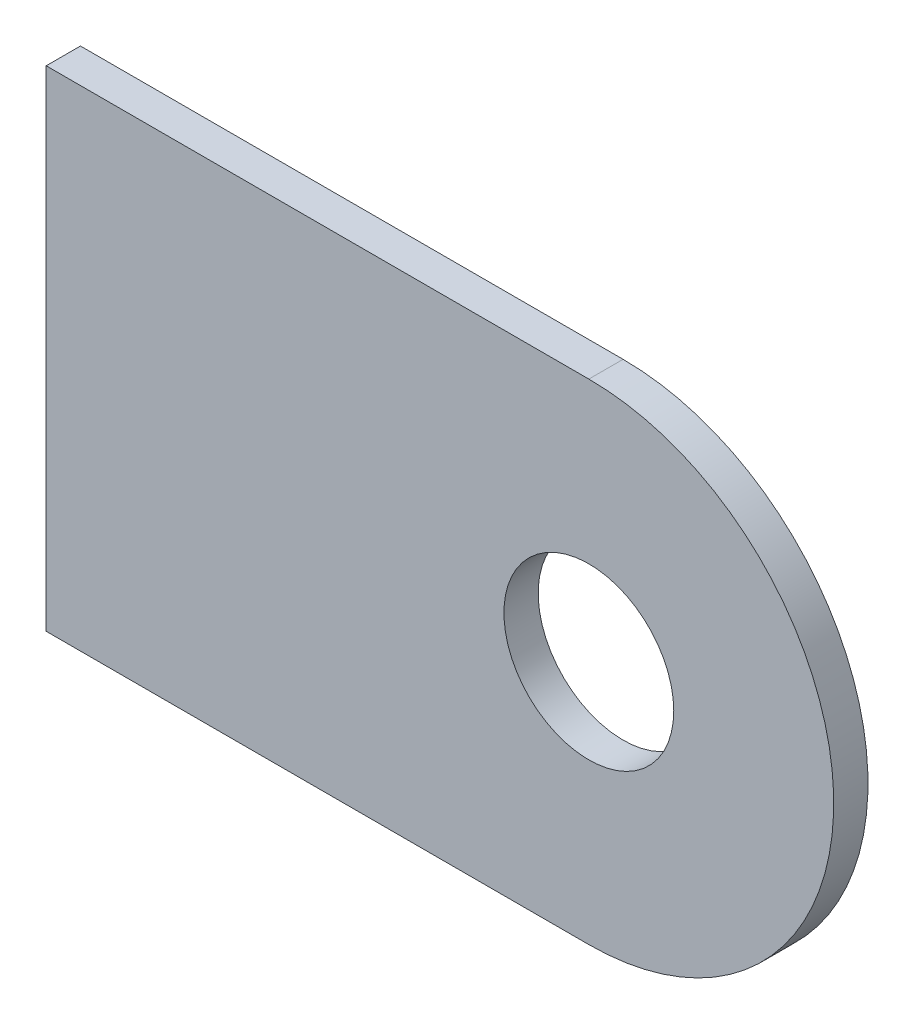
ISO-10303-21;
HEADER;
FILE_DESCRIPTION(('STEP AP214'),'2;1');
FILE_NAME('part.step','',(''),(''),'','','');
FILE_SCHEMA(('AUTOMOTIVE_DESIGN { 1 0 10303 214 1 1 1 1 }'));
ENDSEC;
DATA;
#1=APPLICATION_CONTEXT('core data for automotive mechanical design processes');
#2=APPLICATION_PROTOCOL_DEFINITION('international standard','automotive_design',2000,#1);
#3=PRODUCT_CONTEXT('',#1,'mechanical');
#4=PRODUCT('Part','Part','',(#3));
#5=PRODUCT_RELATED_PRODUCT_CATEGORY('part','',(#4));
#6=PRODUCT_DEFINITION_FORMATION('','',#4);
#7=PRODUCT_DEFINITION_CONTEXT('part definition',#1,'design');
#8=PRODUCT_DEFINITION('design','',#6,#7);
#9=PRODUCT_DEFINITION_SHAPE('','',#8);
#10=(LENGTH_UNIT() NAMED_UNIT(*) SI_UNIT(.MILLI.,.METRE.));
#11=(NAMED_UNIT(*) PLANE_ANGLE_UNIT() SI_UNIT($,.RADIAN.));
#12=(NAMED_UNIT(*) SI_UNIT($,.STERADIAN.) SOLID_ANGLE_UNIT());
#13=UNCERTAINTY_MEASURE_WITH_UNIT(LENGTH_MEASURE(1.E-05),#10,'distance_accuracy_value','');
#14=(GEOMETRIC_REPRESENTATION_CONTEXT(3) GLOBAL_UNCERTAINTY_ASSIGNED_CONTEXT((#13)) GLOBAL_UNIT_ASSIGNED_CONTEXT((#10,
#11,#12)) REPRESENTATION_CONTEXT('',''));
#15=CARTESIAN_POINT('',(0.,0.,0.));
#16=DIRECTION('',(0.,0.,1.));
#17=DIRECTION('',(1.,0.,0.));
#18=AXIS2_PLACEMENT_3D('',#15,#16,#17);
#19=CARTESIAN_POINT('',(25.1587,11.3538,1.5875));
#20=DIRECTION('',(0.,0.,1.));
#21=DIRECTION('',(1.,0.,0.));
#22=AXIS2_PLACEMENT_3D('',#19,#20,#21);
#23=PLANE('',#22);
#24=DIRECTION('',(0.,-1.,0.));
#25=VECTOR('',#24,1.);
#26=CARTESIAN_POINT('',(0.,0.,1.5875));
#27=LINE('',#26,#25);
#28=CARTESIAN_POINT('',(0.,22.7076,1.5875));
#29=VERTEX_POINT('',#28);
#30=CARTESIAN_POINT('',(0.,0.,1.5875));
#31=VERTEX_POINT('',#30);
#32=EDGE_CURVE('E91',#29,#31,#27,.T.);
#33=ORIENTED_EDGE('',*,*,#32,.T.);
#34=DIRECTION('',(1.,0.,0.));
#35=VECTOR('',#34,1.);
#36=CARTESIAN_POINT('',(0.,0.,1.5875));
#37=LINE('',#36,#35);
#38=CARTESIAN_POINT('',(25.1587,0.,1.5875));
#39=VERTEX_POINT('',#38);
#40=EDGE_CURVE('E86',#31,#39,#37,.T.);
#41=ORIENTED_EDGE('',*,*,#40,.T.);
#42=CARTESIAN_POINT('',(25.1587,11.3538,1.5875));
#43=DIRECTION('',(0.,0.,1.));
#44=DIRECTION('',(1.,0.,0.));
#45=AXIS2_PLACEMENT_3D('',#42,#43,#44);
#46=CIRCLE('',#45,11.3538);
#47=CARTESIAN_POINT('',(25.1587,22.7076,1.5875));
#48=VERTEX_POINT('',#47);
#49=EDGE_CURVE('E89',#39,#48,#46,.T.);
#50=ORIENTED_EDGE('',*,*,#49,.T.);
#51=DIRECTION('',(-1.,0.,0.));
#52=VECTOR('',#51,1.);
#53=CARTESIAN_POINT('',(0.,22.7076,1.5875));
#54=LINE('',#53,#52);
#55=EDGE_CURVE('E56',#48,#29,#54,.T.);
#56=ORIENTED_EDGE('',*,*,#55,.T.);
#57=EDGE_LOOP('',(#33,#41,#50,#56));
#58=FACE_BOUND('',#57,.T.);
#59=CARTESIAN_POINT('',(25.1587,11.3538,1.5875));
#60=DIRECTION('',(0.,0.,1.));
#61=DIRECTION('',(1.,0.,0.));
#62=AXIS2_PLACEMENT_3D('',#59,#60,#61);
#63=CIRCLE('',#62,3.937);
#64=CARTESIAN_POINT('',(29.0957,11.3538,1.5875));
#65=VERTEX_POINT('',#64);
#66=EDGE_CURVE('E106',#65,#65,#63,.T.);
#67=ORIENTED_EDGE('',*,*,#66,.F.);
#68=EDGE_LOOP('',(#67));
#69=FACE_BOUND('',#68,.T.);
#70=ADVANCED_FACE('F39',(#58,#69),#23,.T.);
#71=CARTESIAN_POINT('',(25.1587,11.3538,0.));
#72=DIRECTION('',(0.,0.,1.));
#73=DIRECTION('',(1.,0.,0.));
#74=AXIS2_PLACEMENT_3D('',#71,#72,#73);
#75=PLANE('',#74);
#76=DIRECTION('',(0.,-1.,0.));
#77=VECTOR('',#76,1.);
#78=CARTESIAN_POINT('',(0.,0.,0.));
#79=LINE('',#78,#77);
#80=CARTESIAN_POINT('',(0.,22.7076,0.));
#81=VERTEX_POINT('',#80);
#82=CARTESIAN_POINT('',(0.,0.,0.));
#83=VERTEX_POINT('',#82);
#84=EDGE_CURVE('E103',#81,#83,#79,.T.);
#85=ORIENTED_EDGE('',*,*,#84,.F.);
#86=DIRECTION('',(-1.,0.,0.));
#87=VECTOR('',#86,1.);
#88=CARTESIAN_POINT('',(0.,22.7076,0.));
#89=LINE('',#88,#87);
#90=CARTESIAN_POINT('',(25.1587,22.7076,0.));
#91=VERTEX_POINT('',#90);
#92=EDGE_CURVE('E79',#91,#81,#89,.T.);
#93=ORIENTED_EDGE('',*,*,#92,.F.);
#94=CARTESIAN_POINT('',(25.1587,11.3538,0.));
#95=DIRECTION('',(0.,0.,1.));
#96=DIRECTION('',(1.,0.,0.));
#97=AXIS2_PLACEMENT_3D('',#94,#95,#96);
#98=CIRCLE('',#97,11.3538);
#99=CARTESIAN_POINT('',(25.1587,0.,0.));
#100=VERTEX_POINT('',#99);
#101=EDGE_CURVE('E73',#100,#91,#98,.T.);
#102=ORIENTED_EDGE('',*,*,#101,.F.);
#103=DIRECTION('',(1.,0.,0.));
#104=VECTOR('',#103,1.);
#105=CARTESIAN_POINT('',(0.,0.,0.));
#106=LINE('',#105,#104);
#107=EDGE_CURVE('E95',#83,#100,#106,.T.);
#108=ORIENTED_EDGE('',*,*,#107,.F.);
#109=EDGE_LOOP('',(#85,#93,#102,#108));
#110=FACE_BOUND('',#109,.T.);
#111=CARTESIAN_POINT('',(25.1587,11.3538,0.));
#112=DIRECTION('',(0.,0.,1.));
#113=DIRECTION('',(1.,0.,0.));
#114=AXIS2_PLACEMENT_3D('',#111,#112,#113);
#115=CIRCLE('',#114,3.937);
#116=CARTESIAN_POINT('',(29.0957,11.3538,0.));
#117=VERTEX_POINT('',#116);
#118=EDGE_CURVE('E118',#117,#117,#115,.T.);
#119=ORIENTED_EDGE('',*,*,#118,.T.);
#120=EDGE_LOOP('',(#119));
#121=FACE_BOUND('',#120,.T.);
#122=ADVANCED_FACE('F114',(#110,#121),#75,.F.);
#123=CARTESIAN_POINT('',(0.,0.,1.5875));
#124=DIRECTION('',(1.,0.,0.));
#125=DIRECTION('',(0.,1.,0.));
#126=AXIS2_PLACEMENT_3D('',#123,#124,#125);
#127=PLANE('',#126);
#128=ORIENTED_EDGE('',*,*,#84,.T.);
#129=DIRECTION('',(0.,0.,-1.));
#130=VECTOR('',#129,1.);
#131=CARTESIAN_POINT('',(0.,0.,1.5875));
#132=LINE('',#131,#130);
#133=EDGE_CURVE('E11',#31,#83,#132,.T.);
#134=ORIENTED_EDGE('',*,*,#133,.F.);
#135=ORIENTED_EDGE('',*,*,#32,.F.);
#136=DIRECTION('',(0.,0.,-1.));
#137=VECTOR('',#136,1.);
#138=CARTESIAN_POINT('',(0.,22.7076,1.5875));
#139=LINE('',#138,#137);
#140=EDGE_CURVE('E99',#29,#81,#139,.T.);
#141=ORIENTED_EDGE('',*,*,#140,.T.);
#142=EDGE_LOOP('',(#128,#134,#135,#141));
#143=FACE_BOUND('',#142,.T.);
#144=ADVANCED_FACE('F41',(#143),#127,.F.);
#145=CARTESIAN_POINT('',(0.,0.,1.5875));
#146=DIRECTION('',(0.,1.,0.));
#147=DIRECTION('',(-1.,0.,0.));
#148=AXIS2_PLACEMENT_3D('',#145,#146,#147);
#149=PLANE('',#148);
#150=ORIENTED_EDGE('',*,*,#107,.T.);
#151=DIRECTION('',(0.,0.,-1.));
#152=VECTOR('',#151,1.);
#153=CARTESIAN_POINT('',(25.1587,0.,1.5875));
#154=LINE('',#153,#152);
#155=EDGE_CURVE('E48',#39,#100,#154,.T.);
#156=ORIENTED_EDGE('',*,*,#155,.F.);
#157=ORIENTED_EDGE('',*,*,#40,.F.);
#158=ORIENTED_EDGE('',*,*,#133,.T.);
#159=EDGE_LOOP('',(#150,#156,#157,#158));
#160=FACE_BOUND('',#159,.T.);
#161=ADVANCED_FACE('F94',(#160),#149,.F.);
#162=CARTESIAN_POINT('',(25.1587,11.3538,1.5875));
#163=DIRECTION('',(0.,0.,-1.));
#164=DIRECTION('',(-1.,0.,0.));
#165=AXIS2_PLACEMENT_3D('',#162,#163,#164);
#166=CYLINDRICAL_SURFACE('',#165,11.3538);
#167=ORIENTED_EDGE('',*,*,#101,.T.);
#168=DIRECTION('',(0.,0.,-1.));
#169=VECTOR('',#168,1.);
#170=CARTESIAN_POINT('',(25.1587,22.7076,1.5875));
#171=LINE('',#170,#169);
#172=EDGE_CURVE('E96',#48,#91,#171,.T.);
#173=ORIENTED_EDGE('',*,*,#172,.F.);
#174=ORIENTED_EDGE('',*,*,#49,.F.);
#175=ORIENTED_EDGE('',*,*,#155,.T.);
#176=EDGE_LOOP('',(#167,#173,#174,#175));
#177=FACE_BOUND('',#176,.T.);
#178=ADVANCED_FACE('F97',(#177),#166,.T.);
#179=CARTESIAN_POINT('',(0.,22.7076,1.5875));
#180=DIRECTION('',(0.,-1.,0.));
#181=DIRECTION('',(1.,0.,0.));
#182=AXIS2_PLACEMENT_3D('',#179,#180,#181);
#183=PLANE('',#182);
#184=ORIENTED_EDGE('',*,*,#92,.T.);
#185=ORIENTED_EDGE('',*,*,#140,.F.);
#186=ORIENTED_EDGE('',*,*,#55,.F.);
#187=ORIENTED_EDGE('',*,*,#172,.T.);
#188=EDGE_LOOP('',(#184,#185,#186,#187));
#189=FACE_BOUND('',#188,.T.);
#190=ADVANCED_FACE('F111',(#189),#183,.F.);
#191=CARTESIAN_POINT('',(25.1587,11.3538,1.5875));
#192=DIRECTION('',(0.,0.,-1.));
#193=DIRECTION('',(-1.,0.,0.));
#194=AXIS2_PLACEMENT_3D('',#191,#192,#193);
#195=CYLINDRICAL_SURFACE('',#194,3.937);
#196=ORIENTED_EDGE('',*,*,#66,.T.);
#197=EDGE_LOOP('',(#196));
#198=FACE_BOUND('',#197,.T.);
#199=ORIENTED_EDGE('',*,*,#118,.F.);
#200=EDGE_LOOP('',(#199));
#201=FACE_BOUND('',#200,.T.);
#202=ADVANCED_FACE('F124',(#198,#201),#195,.F.);
#203=CLOSED_SHELL('',(#70,#122,#144,#161,#178,#190,#202));
#204=MANIFOLD_SOLID_BREP('B2',#203);
#205=ADVANCED_BREP_SHAPE_REPRESENTATION('',(#18,#204),#14);
#206=SHAPE_DEFINITION_REPRESENTATION(#9,#205);
ENDSEC;
END-ISO-10303-21;
